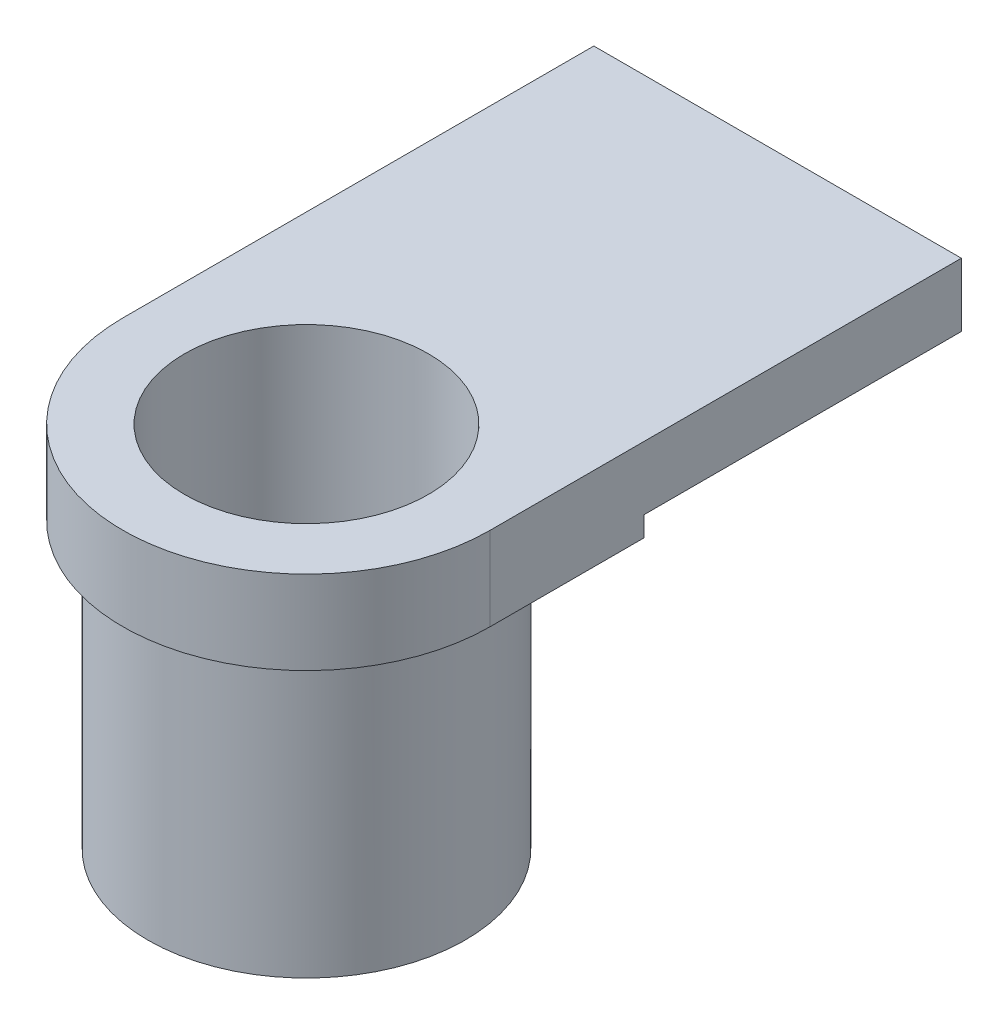
ISO-10303-21;
HEADER;
FILE_DESCRIPTION(('STEP AP214'),'2;1');
FILE_NAME('part.step','',(''),(''),'','','');
FILE_SCHEMA(('AUTOMOTIVE_DESIGN { 1 0 10303 214 1 1 1 1 }'));
ENDSEC;
DATA;
#1=APPLICATION_CONTEXT('core data for automotive mechanical design processes');
#2=APPLICATION_PROTOCOL_DEFINITION('international standard','automotive_design',2000,#1);
#3=PRODUCT_CONTEXT('',#1,'mechanical');
#4=PRODUCT('Part','Part','',(#3));
#5=PRODUCT_RELATED_PRODUCT_CATEGORY('part','',(#4));
#6=PRODUCT_DEFINITION_FORMATION('','',#4);
#7=PRODUCT_DEFINITION_CONTEXT('part definition',#1,'design');
#8=PRODUCT_DEFINITION('design','',#6,#7);
#9=PRODUCT_DEFINITION_SHAPE('','',#8);
#10=(LENGTH_UNIT() NAMED_UNIT(*) SI_UNIT(.MILLI.,.METRE.));
#11=(NAMED_UNIT(*) PLANE_ANGLE_UNIT() SI_UNIT($,.RADIAN.));
#12=(NAMED_UNIT(*) SI_UNIT($,.STERADIAN.) SOLID_ANGLE_UNIT());
#13=UNCERTAINTY_MEASURE_WITH_UNIT(LENGTH_MEASURE(1.E-05),#10,'distance_accuracy_value','');
#14=(GEOMETRIC_REPRESENTATION_CONTEXT(3) GLOBAL_UNCERTAINTY_ASSIGNED_CONTEXT((#13)) GLOBAL_UNIT_ASSIGNED_CONTEXT((#10,
#11,#12)) REPRESENTATION_CONTEXT('',''));
#15=CARTESIAN_POINT('',(0.,0.,0.));
#16=DIRECTION('',(0.,0.,1.));
#17=DIRECTION('',(1.,0.,0.));
#18=AXIS2_PLACEMENT_3D('',#15,#16,#17);
#19=CARTESIAN_POINT('',(0.,2.,0.));
#20=DIRECTION('',(0.,1.,0.));
#21=DIRECTION('',(0.,0.,1.));
#22=AXIS2_PLACEMENT_3D('',#19,#20,#21);
#23=PLANE('',#22);
#24=DIRECTION('',(1.,0.,0.));
#25=VECTOR('',#24,1.);
#26=CARTESIAN_POINT('',(0.,2.,-2.17157776731161));
#27=LINE('',#26,#25);
#28=CARTESIAN_POINT('',(1.02816901408451,2.,-2.17157776731161));
#29=VERTEX_POINT('',#28);
#30=CARTESIAN_POINT('',(2.93372629952385,2.,-2.17157776731161));
#31=VERTEX_POINT('',#30);
#32=EDGE_CURVE('E126',#29,#31,#27,.T.);
#33=ORIENTED_EDGE('',*,*,#32,.T.);
#34=CARTESIAN_POINT('',(0.,2.,0.));
#35=DIRECTION('',(0.,1.,0.));
#36=DIRECTION('',(0.,0.,1.));
#37=AXIS2_PLACEMENT_3D('',#34,#35,#36);
#38=CIRCLE('',#37,3.65);
#39=CARTESIAN_POINT('',(-2.93372629952385,2.,-2.17157776731161));
#40=VERTEX_POINT('',#39);
#41=EDGE_CURVE('E45',#31,#40,#38,.T.);
#42=ORIENTED_EDGE('',*,*,#41,.T.);
#43=DIRECTION('',(1.,0.,0.));
#44=VECTOR('',#43,1.);
#45=CARTESIAN_POINT('',(0.,2.,-2.17157776731161));
#46=LINE('',#45,#44);
#47=CARTESIAN_POINT('',(-1.02816901408451,2.,-2.17157776731161));
#48=VERTEX_POINT('',#47);
#49=EDGE_CURVE('E132',#40,#48,#46,.T.);
#50=ORIENTED_EDGE('',*,*,#49,.T.);
#51=DIRECTION('',(0.,0.,1.));
#52=VECTOR('',#51,1.);
#53=CARTESIAN_POINT('',(-1.02816901408451,2.,0.));
#54=LINE('',#53,#52);
#55=CARTESIAN_POINT('',(-1.02816901408451,2.,2.17157776731161));
#56=VERTEX_POINT('',#55);
#57=EDGE_CURVE('E61',#48,#56,#54,.T.);
#58=ORIENTED_EDGE('',*,*,#57,.T.);
#59=DIRECTION('',(1.,0.,0.));
#60=VECTOR('',#59,1.);
#61=CARTESIAN_POINT('',(0.,2.,2.17157776731161));
#62=LINE('',#61,#60);
#63=CARTESIAN_POINT('',(-2.93372629952385,2.,2.17157776731161));
#64=VERTEX_POINT('',#63);
#65=EDGE_CURVE('E121',#64,#56,#62,.T.);
#66=ORIENTED_EDGE('',*,*,#65,.F.);
#67=CARTESIAN_POINT('',(2.93372629952385,2.,2.17157776731161));
#68=VERTEX_POINT('',#67);
#69=EDGE_CURVE('E130',#64,#68,#38,.T.);
#70=ORIENTED_EDGE('',*,*,#69,.T.);
#71=DIRECTION('',(1.,0.,0.));
#72=VECTOR('',#71,1.);
#73=CARTESIAN_POINT('',(0.,2.,2.17157776731161));
#74=LINE('',#73,#72);
#75=CARTESIAN_POINT('',(1.02816901408451,2.,2.17157776731161));
#76=VERTEX_POINT('',#75);
#77=EDGE_CURVE('E116',#76,#68,#74,.T.);
#78=ORIENTED_EDGE('',*,*,#77,.F.);
#79=DIRECTION('',(0.,0.,1.));
#80=VECTOR('',#79,1.);
#81=CARTESIAN_POINT('',(1.02816901408451,2.,0.));
#82=LINE('',#81,#80);
#83=EDGE_CURVE('E124',#29,#76,#82,.T.);
#84=ORIENTED_EDGE('',*,*,#83,.F.);
#85=EDGE_LOOP('',(#33,#42,#50,#58,#66,#70,#78,#84));
#86=FACE_BOUND('',#85,.T.);
#87=ADVANCED_FACE('F37',(#86),#23,.T.);
#88=CARTESIAN_POINT('',(0.,2.,-2.17157776731161));
#89=DIRECTION('',(0.,0.,-1.));
#90=DIRECTION('',(-1.,0.,0.));
#91=AXIS2_PLACEMENT_3D('',#88,#89,#90);
#92=PLANE('',#91);
#93=DIRECTION('',(1.,0.,0.));
#94=VECTOR('',#93,1.);
#95=CARTESIAN_POINT('',(0.,0.,-2.17157776731161));
#96=LINE('',#95,#94);
#97=CARTESIAN_POINT('',(-2.93372629952385,0.,-2.17157776731161));
#98=VERTEX_POINT('',#97);
#99=CARTESIAN_POINT('',(-1.02816901408451,0.,-2.17157776731161));
#100=VERTEX_POINT('',#99);
#101=EDGE_CURVE('E194',#98,#100,#96,.T.);
#102=ORIENTED_EDGE('',*,*,#101,.T.);
#103=DIRECTION('',(0.,-1.,0.));
#104=VECTOR('',#103,1.);
#105=CARTESIAN_POINT('',(-1.02816901408451,2.,-2.17157776731161));
#106=LINE('',#105,#104);
#107=EDGE_CURVE('E159',#48,#100,#106,.T.);
#108=ORIENTED_EDGE('',*,*,#107,.F.);
#109=ORIENTED_EDGE('',*,*,#49,.F.);
#110=DIRECTION('',(0.,-1.,0.));
#111=VECTOR('',#110,1.);
#112=CARTESIAN_POINT('',(-2.93372629952385,2.,-2.17157776731161));
#113=LINE('',#112,#111);
#114=EDGE_CURVE('E95',#40,#98,#113,.T.);
#115=ORIENTED_EDGE('',*,*,#114,.T.);
#116=EDGE_LOOP('',(#102,#108,#109,#115));
#117=FACE_BOUND('',#116,.T.);
#118=ADVANCED_FACE('F209',(#117),#92,.F.);
#119=CARTESIAN_POINT('',(-1.02816901408451,2.,0.));
#120=DIRECTION('',(1.,0.,0.));
#121=DIRECTION('',(0.,0.,-1.));
#122=AXIS2_PLACEMENT_3D('',#119,#120,#121);
#123=PLANE('',#122);
#124=DIRECTION('',(0.,0.,1.));
#125=VECTOR('',#124,1.);
#126=CARTESIAN_POINT('',(-1.02816901408451,0.,0.));
#127=LINE('',#126,#125);
#128=CARTESIAN_POINT('',(-1.02816901408451,0.,2.17157776731161));
#129=VERTEX_POINT('',#128);
#130=EDGE_CURVE('E196',#100,#129,#127,.T.);
#131=ORIENTED_EDGE('',*,*,#130,.T.);
#132=DIRECTION('',(0.,-1.,0.));
#133=VECTOR('',#132,1.);
#134=CARTESIAN_POINT('',(-1.02816901408451,2.,2.17157776731161));
#135=LINE('',#134,#133);
#136=EDGE_CURVE('E144',#56,#129,#135,.T.);
#137=ORIENTED_EDGE('',*,*,#136,.F.);
#138=ORIENTED_EDGE('',*,*,#57,.F.);
#139=ORIENTED_EDGE('',*,*,#107,.T.);
#140=EDGE_LOOP('',(#131,#137,#138,#139));
#141=FACE_BOUND('',#140,.T.);
#142=ADVANCED_FACE('F208',(#141),#123,.F.);
#143=CARTESIAN_POINT('',(0.,2.,2.17157776731161));
#144=DIRECTION('',(0.,0.,-1.));
#145=DIRECTION('',(-1.,0.,0.));
#146=AXIS2_PLACEMENT_3D('',#143,#144,#145);
#147=PLANE('',#146);
#148=DIRECTION('',(1.,0.,0.));
#149=VECTOR('',#148,1.);
#150=CARTESIAN_POINT('',(0.,0.,2.17157776731161));
#151=LINE('',#150,#149);
#152=CARTESIAN_POINT('',(-2.93372629952385,0.,2.17157776731161));
#153=VERTEX_POINT('',#152);
#154=EDGE_CURVE('E199',#153,#129,#151,.T.);
#155=ORIENTED_EDGE('',*,*,#154,.F.);
#156=DIRECTION('',(0.,-1.,0.));
#157=VECTOR('',#156,1.);
#158=CARTESIAN_POINT('',(-2.93372629952385,2.,2.17157776731161));
#159=LINE('',#158,#157);
#160=EDGE_CURVE('E142',#64,#153,#159,.T.);
#161=ORIENTED_EDGE('',*,*,#160,.F.);
#162=ORIENTED_EDGE('',*,*,#65,.T.);
#163=ORIENTED_EDGE('',*,*,#136,.T.);
#164=EDGE_LOOP('',(#155,#161,#162,#163));
#165=FACE_BOUND('',#164,.T.);
#166=ADVANCED_FACE('F219',(#165),#147,.T.);
#167=CARTESIAN_POINT('',(1.02816901408451,2.,0.));
#168=DIRECTION('',(1.,0.,0.));
#169=DIRECTION('',(0.,0.,-1.));
#170=AXIS2_PLACEMENT_3D('',#167,#168,#169);
#171=PLANE('',#170);
#172=DIRECTION('',(0.,0.,1.));
#173=VECTOR('',#172,1.);
#174=CARTESIAN_POINT('',(1.02816901408451,0.,0.));
#175=LINE('',#174,#173);
#176=CARTESIAN_POINT('',(1.02816901408451,0.,-2.17157776731161));
#177=VERTEX_POINT('',#176);
#178=CARTESIAN_POINT('',(1.02816901408451,0.,2.17157776731161));
#179=VERTEX_POINT('',#178);
#180=EDGE_CURVE('E181',#177,#179,#175,.T.);
#181=ORIENTED_EDGE('',*,*,#180,.F.);
#182=DIRECTION('',(0.,-1.,0.));
#183=VECTOR('',#182,1.);
#184=CARTESIAN_POINT('',(1.02816901408451,2.,-2.17157776731161));
#185=LINE('',#184,#183);
#186=EDGE_CURVE('E103',#29,#177,#185,.T.);
#187=ORIENTED_EDGE('',*,*,#186,.F.);
#188=ORIENTED_EDGE('',*,*,#83,.T.);
#189=DIRECTION('',(0.,-1.,0.));
#190=VECTOR('',#189,1.);
#191=CARTESIAN_POINT('',(1.02816901408451,2.,2.17157776731161));
#192=LINE('',#191,#190);
#193=EDGE_CURVE('E113',#76,#179,#192,.T.);
#194=ORIENTED_EDGE('',*,*,#193,.T.);
#195=EDGE_LOOP('',(#181,#187,#188,#194));
#196=FACE_BOUND('',#195,.T.);
#197=ADVANCED_FACE('F39',(#196),#171,.T.);
#198=CARTESIAN_POINT('',(0.,2.,-2.17157776731161));
#199=DIRECTION('',(0.,0.,-1.));
#200=DIRECTION('',(-1.,0.,0.));
#201=AXIS2_PLACEMENT_3D('',#198,#199,#200);
#202=PLANE('',#201);
#203=DIRECTION('',(1.,0.,0.));
#204=VECTOR('',#203,1.);
#205=CARTESIAN_POINT('',(0.,0.,-2.17157776731161));
#206=LINE('',#205,#204);
#207=CARTESIAN_POINT('',(2.93372629952385,0.,-2.17157776731161));
#208=VERTEX_POINT('',#207);
#209=EDGE_CURVE('E176',#177,#208,#206,.T.);
#210=ORIENTED_EDGE('',*,*,#209,.T.);
#211=DIRECTION('',(0.,-1.,0.));
#212=VECTOR('',#211,1.);
#213=CARTESIAN_POINT('',(2.93372629952385,2.,-2.17157776731161));
#214=LINE('',#213,#212);
#215=EDGE_CURVE('E160',#31,#208,#214,.T.);
#216=ORIENTED_EDGE('',*,*,#215,.F.);
#217=ORIENTED_EDGE('',*,*,#32,.F.);
#218=ORIENTED_EDGE('',*,*,#186,.T.);
#219=EDGE_LOOP('',(#210,#216,#217,#218));
#220=FACE_BOUND('',#219,.T.);
#221=ADVANCED_FACE('F175',(#220),#202,.F.);
#222=CARTESIAN_POINT('',(0.,2.,0.));
#223=DIRECTION('',(0.,-1.,0.));
#224=DIRECTION('',(0.,0.,-1.));
#225=AXIS2_PLACEMENT_3D('',#222,#223,#224);
#226=CYLINDRICAL_SURFACE('',#225,3.65);
#227=CARTESIAN_POINT('',(0.,0.,0.));
#228=DIRECTION('',(0.,1.,0.));
#229=DIRECTION('',(0.,0.,1.));
#230=AXIS2_PLACEMENT_3D('',#227,#228,#229);
#231=CIRCLE('',#230,3.65);
#232=EDGE_CURVE('E192',#98,#153,#231,.T.);
#233=ORIENTED_EDGE('',*,*,#232,.F.);
#234=ORIENTED_EDGE('',*,*,#114,.F.);
#235=ORIENTED_EDGE('',*,*,#41,.F.);
#236=ORIENTED_EDGE('',*,*,#215,.T.);
#237=CARTESIAN_POINT('',(2.93372629952385,0.,2.17157776731161));
#238=VERTEX_POINT('',#237);
#239=EDGE_CURVE('E182',#238,#208,#231,.T.);
#240=ORIENTED_EDGE('',*,*,#239,.F.);
#241=DIRECTION('',(0.,-1.,0.));
#242=VECTOR('',#241,1.);
#243=CARTESIAN_POINT('',(2.93372629952385,2.,2.17157776731161));
#244=LINE('',#243,#242);
#245=EDGE_CURVE('E120',#68,#238,#244,.T.);
#246=ORIENTED_EDGE('',*,*,#245,.F.);
#247=ORIENTED_EDGE('',*,*,#69,.F.);
#248=ORIENTED_EDGE('',*,*,#160,.T.);
#249=EDGE_LOOP('',(#233,#234,#235,#236,#240,#246,#247,#248));
#250=FACE_BOUND('',#249,.T.);
#251=CARTESIAN_POINT('',(0.,11.,0.));
#252=DIRECTION('',(0.,1.,0.));
#253=DIRECTION('',(0.,0.,1.));
#254=AXIS2_PLACEMENT_3D('',#251,#252,#253);
#255=CIRCLE('',#254,3.65);
#256=CARTESIAN_POINT('',(0.,11.,3.65));
#257=VERTEX_POINT('',#256);
#258=EDGE_CURVE('E315',#257,#257,#255,.F.);
#259=ORIENTED_EDGE('',*,*,#258,.F.);
#260=EDGE_LOOP('',(#259));
#261=FACE_BOUND('',#260,.T.);
#262=ADVANCED_FACE('F213',(#250,#261),#226,.F.);
#263=CARTESIAN_POINT('',(0.,2.,2.17157776731161));
#264=DIRECTION('',(0.,0.,-1.));
#265=DIRECTION('',(-1.,0.,0.));
#266=AXIS2_PLACEMENT_3D('',#263,#264,#265);
#267=PLANE('',#266);
#268=DIRECTION('',(1.,0.,0.));
#269=VECTOR('',#268,1.);
#270=CARTESIAN_POINT('',(0.,0.,2.17157776731161));
#271=LINE('',#270,#269);
#272=EDGE_CURVE('E118',#179,#238,#271,.T.);
#273=ORIENTED_EDGE('',*,*,#272,.F.);
#274=ORIENTED_EDGE('',*,*,#193,.F.);
#275=ORIENTED_EDGE('',*,*,#77,.T.);
#276=ORIENTED_EDGE('',*,*,#245,.T.);
#277=EDGE_LOOP('',(#273,#274,#275,#276));
#278=FACE_BOUND('',#277,.T.);
#279=ADVANCED_FACE('F114',(#278),#267,.T.);
#280=CARTESIAN_POINT('',(0.,2.,0.));
#281=DIRECTION('',(0.,-1.,0.));
#282=DIRECTION('',(0.,0.,-1.));
#283=AXIS2_PLACEMENT_3D('',#280,#281,#282);
#284=CYLINDRICAL_SURFACE('',#283,4.75);
#285=CARTESIAN_POINT('',(0.,8.5,0.));
#286=DIRECTION('',(0.,1.,0.));
#287=DIRECTION('',(0.,0.,1.));
#288=AXIS2_PLACEMENT_3D('',#285,#286,#287);
#289=CIRCLE('',#288,4.75);
#290=CARTESIAN_POINT('',(-1.14812375049961,8.5,-4.60915522124594));
#291=VERTEX_POINT('',#290);
#292=CARTESIAN_POINT('',(1.14812375049961,8.5,-4.60915522124594));
#293=VERTEX_POINT('',#292);
#294=EDGE_CURVE('E184',#291,#293,#289,.T.);
#295=ORIENTED_EDGE('',*,*,#294,.F.);
#296=DIRECTION('',(0.,-1.,0.));
#297=VECTOR('',#296,1.);
#298=CARTESIAN_POINT('',(-1.14812375049961,2.,-4.60915522124594));
#299=LINE('',#298,#297);
#300=CARTESIAN_POINT('',(-1.14812375049961,8.1,-4.60915522124594));
#301=VERTEX_POINT('',#300);
#302=EDGE_CURVE('E301',#291,#301,#299,.T.);
#303=ORIENTED_EDGE('',*,*,#302,.T.);
#304=CARTESIAN_POINT('',(0.,8.1,0.));
#305=DIRECTION('',(0.,1.,0.));
#306=DIRECTION('',(0.,0.,1.));
#307=AXIS2_PLACEMENT_3D('',#304,#305,#306);
#308=CIRCLE('',#307,4.75);
#309=CARTESIAN_POINT('',(1.14812375049961,8.1,-4.60915522124594));
#310=VERTEX_POINT('',#309);
#311=EDGE_CURVE('E11',#310,#301,#308,.T.);
#312=ORIENTED_EDGE('',*,*,#311,.F.);
#313=DIRECTION('',(0.,-1.,0.));
#314=VECTOR('',#313,1.);
#315=CARTESIAN_POINT('',(1.14812375049961,2.,-4.60915522124594));
#316=LINE('',#315,#314);
#317=EDGE_CURVE('E298',#310,#293,#316,.F.);
#318=ORIENTED_EDGE('',*,*,#317,.T.);
#319=EDGE_LOOP('',(#295,#303,#312,#318));
#320=FACE_BOUND('',#319,.T.);
#321=CARTESIAN_POINT('',(0.,0.,0.));
#322=DIRECTION('',(0.,1.,0.));
#323=DIRECTION('',(0.,0.,1.));
#324=AXIS2_PLACEMENT_3D('',#321,#322,#323);
#325=CIRCLE('',#324,4.75);
#326=CARTESIAN_POINT('',(0.,0.,4.75));
#327=VERTEX_POINT('',#326);
#328=EDGE_CURVE('E127',#327,#327,#325,.T.);
#329=ORIENTED_EDGE('',*,*,#328,.T.);
#330=EDGE_LOOP('',(#329));
#331=FACE_BOUND('',#330,.T.);
#332=ADVANCED_FACE('F370',(#320,#331),#284,.T.);
#333=CARTESIAN_POINT('',(0.,0.,0.));
#334=DIRECTION('',(0.,1.,0.));
#335=DIRECTION('',(0.,0.,1.));
#336=AXIS2_PLACEMENT_3D('',#333,#334,#335);
#337=PLANE('',#336);
#338=ORIENTED_EDGE('',*,*,#180,.T.);
#339=ORIENTED_EDGE('',*,*,#272,.T.);
#340=ORIENTED_EDGE('',*,*,#239,.T.);
#341=ORIENTED_EDGE('',*,*,#209,.F.);
#342=EDGE_LOOP('',(#338,#339,#340,#341));
#343=FACE_BOUND('',#342,.T.);
#344=ORIENTED_EDGE('',*,*,#101,.F.);
#345=ORIENTED_EDGE('',*,*,#232,.T.);
#346=ORIENTED_EDGE('',*,*,#154,.T.);
#347=ORIENTED_EDGE('',*,*,#130,.F.);
#348=EDGE_LOOP('',(#344,#345,#346,#347));
#349=FACE_BOUND('',#348,.T.);
#350=ORIENTED_EDGE('',*,*,#328,.F.);
#351=EDGE_LOOP('',(#350));
#352=FACE_BOUND('',#351,.T.);
#353=ADVANCED_FACE('F179',(#343,#349,#352),#337,.F.);
#354=CARTESIAN_POINT('',(0.,8.5,0.));
#355=DIRECTION('',(0.,1.,0.));
#356=DIRECTION('',(0.,0.,1.));
#357=AXIS2_PLACEMENT_3D('',#354,#355,#356);
#358=PLANE('',#357);
#359=DIRECTION('',(0.,0.,-1.));
#360=VECTOR('',#359,1.);
#361=CARTESIAN_POINT('',(-5.5,8.5,0.));
#362=LINE('',#361,#360);
#363=CARTESIAN_POINT('',(-5.5,8.5,0.));
#364=VERTEX_POINT('',#363);
#365=CARTESIAN_POINT('',(-5.5,8.5,-4.60915522124594));
#366=VERTEX_POINT('',#365);
#367=EDGE_CURVE('E304',#364,#366,#362,.T.);
#368=ORIENTED_EDGE('',*,*,#367,.T.);
#369=DIRECTION('',(1.,0.,0.));
#370=VECTOR('',#369,1.);
#371=CARTESIAN_POINT('',(0.,8.5,-4.60915522124594));
#372=LINE('',#371,#370);
#373=EDGE_CURVE('E272',#366,#291,#372,.T.);
#374=ORIENTED_EDGE('',*,*,#373,.T.);
#375=ORIENTED_EDGE('',*,*,#294,.T.);
#376=CARTESIAN_POINT('',(5.5,8.5,-4.60915522124594));
#377=VERTEX_POINT('',#376);
#378=EDGE_CURVE('E294',#293,#377,#372,.T.);
#379=ORIENTED_EDGE('',*,*,#378,.T.);
#380=DIRECTION('',(0.,0.,-1.));
#381=VECTOR('',#380,1.);
#382=CARTESIAN_POINT('',(5.5,8.5,0.));
#383=LINE('',#382,#381);
#384=CARTESIAN_POINT('',(5.5,8.5,0.));
#385=VERTEX_POINT('',#384);
#386=EDGE_CURVE('E308',#385,#377,#383,.T.);
#387=ORIENTED_EDGE('',*,*,#386,.F.);
#388=CARTESIAN_POINT('',(0.,8.5,0.));
#389=DIRECTION('',(0.,1.,0.));
#390=DIRECTION('',(0.,0.,1.));
#391=AXIS2_PLACEMENT_3D('',#388,#389,#390);
#392=CIRCLE('',#391,5.5);
#393=EDGE_CURVE('E319',#364,#385,#392,.T.);
#394=ORIENTED_EDGE('',*,*,#393,.F.);
#395=EDGE_LOOP('',(#368,#374,#375,#379,#387,#394));
#396=FACE_BOUND('',#395,.T.);
#397=ADVANCED_FACE('F338',(#396),#358,.F.);
#398=CARTESIAN_POINT('',(-5.5,11.,0.));
#399=DIRECTION('',(-1.,0.,0.));
#400=DIRECTION('',(0.,0.,1.));
#401=AXIS2_PLACEMENT_3D('',#398,#399,#400);
#402=PLANE('',#401);
#403=DIRECTION('',(0.,1.,0.));
#404=VECTOR('',#403,1.);
#405=CARTESIAN_POINT('',(-5.5,8.1,-4.60915522124594));
#406=LINE('',#405,#404);
#407=CARTESIAN_POINT('',(-5.5,9.1,-4.60915522124594));
#408=VERTEX_POINT('',#407);
#409=EDGE_CURVE('E267',#366,#408,#406,.T.);
#410=ORIENTED_EDGE('',*,*,#409,.F.);
#411=ORIENTED_EDGE('',*,*,#367,.F.);
#412=DIRECTION('',(0.,-1.,0.));
#413=VECTOR('',#412,1.);
#414=CARTESIAN_POINT('',(-5.5,11.,0.));
#415=LINE('',#414,#413);
#416=CARTESIAN_POINT('',(-5.5,11.,0.));
#417=VERTEX_POINT('',#416);
#418=EDGE_CURVE('E187',#417,#364,#415,.T.);
#419=ORIENTED_EDGE('',*,*,#418,.F.);
#420=DIRECTION('',(0.,0.,-1.));
#421=VECTOR('',#420,1.);
#422=CARTESIAN_POINT('',(-5.5,11.,0.));
#423=LINE('',#422,#421);
#424=CARTESIAN_POINT('',(-5.5,11.,-14.1));
#425=VERTEX_POINT('',#424);
#426=EDGE_CURVE('E305',#417,#425,#423,.T.);
#427=ORIENTED_EDGE('',*,*,#426,.T.);
#428=DIRECTION('',(0.,-1.,0.));
#429=VECTOR('',#428,1.);
#430=CARTESIAN_POINT('',(-5.5,11.,-14.1));
#431=LINE('',#430,#429);
#432=CARTESIAN_POINT('',(-5.5,9.1,-14.1));
#433=VERTEX_POINT('',#432);
#434=EDGE_CURVE('E287',#425,#433,#431,.T.);
#435=ORIENTED_EDGE('',*,*,#434,.T.);
#436=DIRECTION('',(0.,0.,1.));
#437=VECTOR('',#436,1.);
#438=CARTESIAN_POINT('',(-5.5,9.1,-4.60915522124594));
#439=LINE('',#438,#437);
#440=EDGE_CURVE('E52',#433,#408,#439,.T.);
#441=ORIENTED_EDGE('',*,*,#440,.T.);
#442=EDGE_LOOP('',(#410,#411,#419,#427,#435,#441));
#443=FACE_BOUND('',#442,.T.);
#444=ADVANCED_FACE('F285',(#443),#402,.T.);
#445=CARTESIAN_POINT('',(0.,11.,0.));
#446=DIRECTION('',(0.,-1.,0.));
#447=DIRECTION('',(0.,0.,-1.));
#448=AXIS2_PLACEMENT_3D('',#445,#446,#447);
#449=CYLINDRICAL_SURFACE('',#448,5.5);
#450=ORIENTED_EDGE('',*,*,#393,.T.);
#451=DIRECTION('',(0.,-1.,0.));
#452=VECTOR('',#451,1.);
#453=CARTESIAN_POINT('',(5.5,11.,0.));
#454=LINE('',#453,#452);
#455=CARTESIAN_POINT('',(5.5,11.,0.));
#456=VERTEX_POINT('',#455);
#457=EDGE_CURVE('E327',#456,#385,#454,.T.);
#458=ORIENTED_EDGE('',*,*,#457,.F.);
#459=CARTESIAN_POINT('',(0.,11.,0.));
#460=DIRECTION('',(0.,1.,0.));
#461=DIRECTION('',(0.,0.,1.));
#462=AXIS2_PLACEMENT_3D('',#459,#460,#461);
#463=CIRCLE('',#462,5.5);
#464=EDGE_CURVE('E307',#417,#456,#463,.T.);
#465=ORIENTED_EDGE('',*,*,#464,.F.);
#466=ORIENTED_EDGE('',*,*,#418,.T.);
#467=EDGE_LOOP('',(#450,#458,#465,#466));
#468=FACE_BOUND('',#467,.T.);
#469=ADVANCED_FACE('F333',(#468),#449,.T.);
#470=CARTESIAN_POINT('',(5.5,11.,0.));
#471=DIRECTION('',(-1.,0.,0.));
#472=DIRECTION('',(0.,0.,1.));
#473=AXIS2_PLACEMENT_3D('',#470,#471,#472);
#474=PLANE('',#473);
#475=ORIENTED_EDGE('',*,*,#386,.T.);
#476=DIRECTION('',(0.,1.,0.));
#477=VECTOR('',#476,1.);
#478=CARTESIAN_POINT('',(5.5,8.1,-4.60915522124594));
#479=LINE('',#478,#477);
#480=CARTESIAN_POINT('',(5.5,9.1,-4.60915522124594));
#481=VERTEX_POINT('',#480);
#482=EDGE_CURVE('E276',#377,#481,#479,.T.);
#483=ORIENTED_EDGE('',*,*,#482,.T.);
#484=DIRECTION('',(0.,0.,-1.));
#485=VECTOR('',#484,1.);
#486=CARTESIAN_POINT('',(5.5,9.1,-4.60915522124594));
#487=LINE('',#486,#485);
#488=CARTESIAN_POINT('',(5.5,9.1,-14.1));
#489=VERTEX_POINT('',#488);
#490=EDGE_CURVE('E281',#481,#489,#487,.T.);
#491=ORIENTED_EDGE('',*,*,#490,.T.);
#492=DIRECTION('',(0.,-1.,0.));
#493=VECTOR('',#492,1.);
#494=CARTESIAN_POINT('',(5.5,11.,-14.1));
#495=LINE('',#494,#493);
#496=CARTESIAN_POINT('',(5.5,11.,-14.1));
#497=VERTEX_POINT('',#496);
#498=EDGE_CURVE('E324',#497,#489,#495,.T.);
#499=ORIENTED_EDGE('',*,*,#498,.F.);
#500=DIRECTION('',(0.,0.,-1.));
#501=VECTOR('',#500,1.);
#502=CARTESIAN_POINT('',(5.5,11.,0.));
#503=LINE('',#502,#501);
#504=EDGE_CURVE('E310',#456,#497,#503,.T.);
#505=ORIENTED_EDGE('',*,*,#504,.F.);
#506=ORIENTED_EDGE('',*,*,#457,.T.);
#507=EDGE_LOOP('',(#475,#483,#491,#499,#505,#506));
#508=FACE_BOUND('',#507,.T.);
#509=ADVANCED_FACE('F340',(#508),#474,.F.);
#510=CARTESIAN_POINT('',(0.,11.,-14.1));
#511=DIRECTION('',(0.,0.,-1.));
#512=DIRECTION('',(-1.,0.,0.));
#513=AXIS2_PLACEMENT_3D('',#510,#511,#512);
#514=PLANE('',#513);
#515=DIRECTION('',(-1.,0.,0.));
#516=VECTOR('',#515,1.);
#517=CARTESIAN_POINT('',(-5.5,9.1,-14.1));
#518=LINE('',#517,#516);
#519=EDGE_CURVE('E288',#489,#433,#518,.T.);
#520=ORIENTED_EDGE('',*,*,#519,.T.);
#521=ORIENTED_EDGE('',*,*,#434,.F.);
#522=DIRECTION('',(1.,0.,0.));
#523=VECTOR('',#522,1.);
#524=CARTESIAN_POINT('',(0.,11.,-14.1));
#525=LINE('',#524,#523);
#526=EDGE_CURVE('E312',#425,#497,#525,.T.);
#527=ORIENTED_EDGE('',*,*,#526,.T.);
#528=ORIENTED_EDGE('',*,*,#498,.T.);
#529=EDGE_LOOP('',(#520,#521,#527,#528));
#530=FACE_BOUND('',#529,.T.);
#531=ADVANCED_FACE('F348',(#530),#514,.T.);
#532=CARTESIAN_POINT('',(0.,11.,0.));
#533=DIRECTION('',(0.,1.,0.));
#534=DIRECTION('',(0.,0.,1.));
#535=AXIS2_PLACEMENT_3D('',#532,#533,#534);
#536=PLANE('',#535);
#537=ORIENTED_EDGE('',*,*,#426,.F.);
#538=ORIENTED_EDGE('',*,*,#464,.T.);
#539=ORIENTED_EDGE('',*,*,#504,.T.);
#540=ORIENTED_EDGE('',*,*,#526,.F.);
#541=EDGE_LOOP('',(#537,#538,#539,#540));
#542=FACE_BOUND('',#541,.T.);
#543=ORIENTED_EDGE('',*,*,#258,.T.);
#544=EDGE_LOOP('',(#543));
#545=FACE_BOUND('',#544,.T.);
#546=ADVANCED_FACE('F345',(#542,#545),#536,.T.);
#547=CARTESIAN_POINT('',(0.,8.1,0.));
#548=DIRECTION('',(0.,1.,0.));
#549=DIRECTION('',(0.,0.,1.));
#550=AXIS2_PLACEMENT_3D('',#547,#548,#549);
#551=PLANE('',#550);
#552=ORIENTED_EDGE('',*,*,#311,.T.);
#553=DIRECTION('',(1.,0.,0.));
#554=VECTOR('',#553,1.);
#555=CARTESIAN_POINT('',(5.5,8.1,-4.60915522124594));
#556=LINE('',#555,#554);
#557=EDGE_CURVE('E277',#301,#310,#556,.T.);
#558=ORIENTED_EDGE('',*,*,#557,.T.);
#559=EDGE_LOOP('',(#552,#558));
#560=FACE_BOUND('',#559,.T.);
#561=ADVANCED_FACE('F355',(#560),#551,.T.);
#562=CARTESIAN_POINT('',(5.5,8.1,-4.60915522124594));
#563=DIRECTION('',(0.,0.,1.));
#564=DIRECTION('',(1.,0.,0.));
#565=AXIS2_PLACEMENT_3D('',#562,#563,#564);
#566=PLANE('',#565);
#567=ORIENTED_EDGE('',*,*,#373,.F.);
#568=ORIENTED_EDGE('',*,*,#409,.T.);
#569=DIRECTION('',(1.,0.,0.));
#570=VECTOR('',#569,1.);
#571=CARTESIAN_POINT('',(5.5,9.1,-4.60915522124594));
#572=LINE('',#571,#570);
#573=EDGE_CURVE('E269',#408,#481,#572,.T.);
#574=ORIENTED_EDGE('',*,*,#573,.T.);
#575=ORIENTED_EDGE('',*,*,#482,.F.);
#576=ORIENTED_EDGE('',*,*,#378,.F.);
#577=ORIENTED_EDGE('',*,*,#317,.F.);
#578=ORIENTED_EDGE('',*,*,#557,.F.);
#579=ORIENTED_EDGE('',*,*,#302,.F.);
#580=EDGE_LOOP('',(#567,#568,#574,#575,#576,#577,#578,#579));
#581=FACE_BOUND('',#580,.T.);
#582=ADVANCED_FACE('F268',(#581),#566,.F.);
#583=CARTESIAN_POINT('',(0.,9.1,0.));
#584=DIRECTION('',(0.,1.,0.));
#585=DIRECTION('',(0.,0.,1.));
#586=AXIS2_PLACEMENT_3D('',#583,#584,#585);
#587=PLANE('',#586);
#588=ORIENTED_EDGE('',*,*,#519,.F.);
#589=ORIENTED_EDGE('',*,*,#490,.F.);
#590=ORIENTED_EDGE('',*,*,#573,.F.);
#591=ORIENTED_EDGE('',*,*,#440,.F.);
#592=EDGE_LOOP('',(#588,#589,#590,#591));
#593=FACE_BOUND('',#592,.T.);
#594=ADVANCED_FACE('F279',(#593),#587,.F.);
#595=CLOSED_SHELL('',(#87,#118,#142,#166,#197,#221,#262,#279,#332,#353,#397,#444,#469,#509,#531,
#546,#561,#582,#594));
#596=MANIFOLD_SOLID_BREP('B2',#595);
#597=ADVANCED_BREP_SHAPE_REPRESENTATION('',(#18,#596),#14);
#598=SHAPE_DEFINITION_REPRESENTATION(#9,#597);
ENDSEC;
END-ISO-10303-21;
